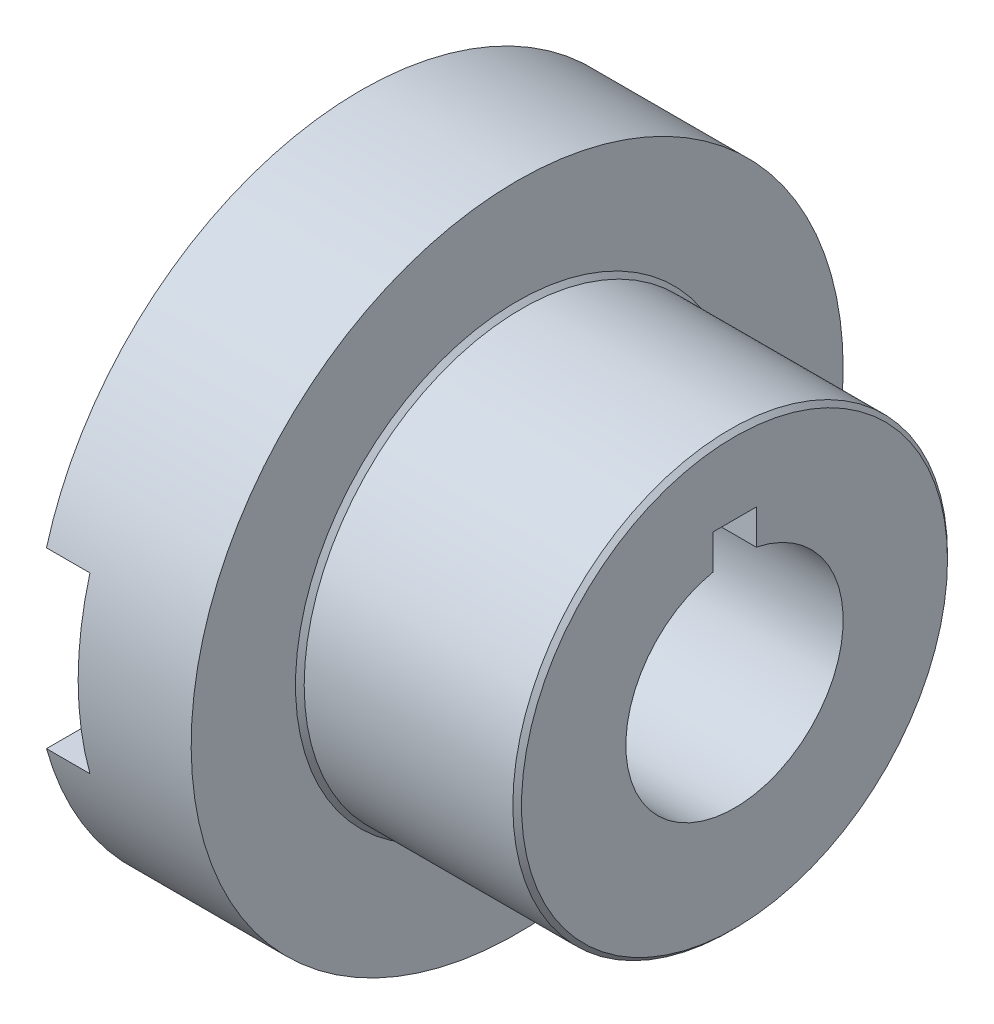
ISO-10303-21;
HEADER;
FILE_DESCRIPTION(('STEP AP214'),'2;1');
FILE_NAME('part.step','',(''),(''),'','','');
FILE_SCHEMA(('AUTOMOTIVE_DESIGN { 1 0 10303 214 1 1 1 1 }'));
ENDSEC;
DATA;
#1=APPLICATION_CONTEXT('core data for automotive mechanical design processes');
#2=APPLICATION_PROTOCOL_DEFINITION('international standard','automotive_design',2000,#1);
#3=PRODUCT_CONTEXT('',#1,'mechanical');
#4=PRODUCT('Part','Part','',(#3));
#5=PRODUCT_RELATED_PRODUCT_CATEGORY('part','',(#4));
#6=PRODUCT_DEFINITION_FORMATION('','',#4);
#7=PRODUCT_DEFINITION_CONTEXT('part definition',#1,'design');
#8=PRODUCT_DEFINITION('design','',#6,#7);
#9=PRODUCT_DEFINITION_SHAPE('','',#8);
#10=(LENGTH_UNIT() NAMED_UNIT(*) SI_UNIT(.MILLI.,.METRE.));
#11=(NAMED_UNIT(*) PLANE_ANGLE_UNIT() SI_UNIT($,.RADIAN.));
#12=(NAMED_UNIT(*) SI_UNIT($,.STERADIAN.) SOLID_ANGLE_UNIT());
#13=UNCERTAINTY_MEASURE_WITH_UNIT(LENGTH_MEASURE(1.E-05),#10,'distance_accuracy_value','');
#14=(GEOMETRIC_REPRESENTATION_CONTEXT(3) GLOBAL_UNCERTAINTY_ASSIGNED_CONTEXT((#13)) GLOBAL_UNIT_ASSIGNED_CONTEXT((#10,
#11,#12)) REPRESENTATION_CONTEXT('',''));
#15=CARTESIAN_POINT('',(0.,0.,0.));
#16=DIRECTION('',(0.,0.,1.));
#17=DIRECTION('',(1.,0.,0.));
#18=AXIS2_PLACEMENT_3D('',#15,#16,#17);
#19=CARTESIAN_POINT('',(10.,0.,0.));
#20=DIRECTION('',(-1.,0.,0.));
#21=DIRECTION('',(0.,0.,1.));
#22=AXIS2_PLACEMENT_3D('',#19,#20,#21);
#23=PLANE('',#22);
#24=CARTESIAN_POINT('',(9.99999999999999,0.,0.));
#25=DIRECTION('',(-1.,0.,0.));
#26=DIRECTION('',(0.,0.,1.));
#27=AXIS2_PLACEMENT_3D('',#24,#25,#26);
#28=CIRCLE('',#27,25.);
#29=CARTESIAN_POINT('',(9.99999999999999,20.,-15.));
#30=VERTEX_POINT('',#29);
#31=CARTESIAN_POINT('',(9.99999999999999,-20.,-15.));
#32=VERTEX_POINT('',#31);
#33=EDGE_CURVE('E213',#30,#32,#28,.T.);
#34=ORIENTED_EDGE('',*,*,#33,.F.);
#35=DIRECTION('',(0.,0.,-1.));
#36=VECTOR('',#35,1.);
#37=CARTESIAN_POINT('',(10.,20.,-72.2841614740048));
#38=LINE('',#37,#36);
#39=CARTESIAN_POINT('',(10.,20.,-72.2841614740048));
#40=VERTEX_POINT('',#39);
#41=EDGE_CURVE('E178',#30,#40,#38,.T.);
#42=ORIENTED_EDGE('',*,*,#41,.T.);
#43=CARTESIAN_POINT('',(10.,0.,0.));
#44=DIRECTION('',(-1.,0.,0.));
#45=DIRECTION('',(0.,0.,1.));
#46=AXIS2_PLACEMENT_3D('',#43,#44,#45);
#47=CIRCLE('',#46,75.);
#48=CARTESIAN_POINT('',(10.,-20.,-72.2841614740048));
#49=VERTEX_POINT('',#48);
#50=EDGE_CURVE('E164',#40,#49,#47,.T.);
#51=ORIENTED_EDGE('',*,*,#50,.T.);
#52=DIRECTION('',(0.,0.,1.));
#53=VECTOR('',#52,1.);
#54=CARTESIAN_POINT('',(10.,-20.,-72.2841614740048));
#55=LINE('',#54,#53);
#56=EDGE_CURVE('E170',#49,#32,#55,.T.);
#57=ORIENTED_EDGE('',*,*,#56,.T.);
#58=EDGE_LOOP('',(#34,#42,#51,#57));
#59=FACE_BOUND('',#58,.T.);
#60=ADVANCED_FACE('F47',(#59),#23,.T.);
#61=CARTESIAN_POINT('',(0.,0.,0.));
#62=DIRECTION('',(1.,0.,0.));
#63=DIRECTION('',(0.,0.,-1.));
#64=AXIS2_PLACEMENT_3D('',#61,#62,#63);
#65=PLANE('',#64);
#66=CARTESIAN_POINT('',(0.,0.,0.));
#67=DIRECTION('',(1.,0.,0.));
#68=DIRECTION('',(0.,0.,-1.));
#69=AXIS2_PLACEMENT_3D('',#66,#67,#68);
#70=CIRCLE('',#69,75.);
#71=CARTESIAN_POINT('',(0.,20.,-72.2841614740048));
#72=VERTEX_POINT('',#71);
#73=CARTESIAN_POINT('',(0.,20.,72.2841614740048));
#74=VERTEX_POINT('',#73);
#75=EDGE_CURVE('E207',#72,#74,#70,.T.);
#76=ORIENTED_EDGE('',*,*,#75,.F.);
#77=DIRECTION('',(0.,0.,-1.));
#78=VECTOR('',#77,1.);
#79=CARTESIAN_POINT('',(0.,20.,-72.2841614740048));
#80=LINE('',#79,#78);
#81=EDGE_CURVE('E169',#74,#72,#80,.T.);
#82=ORIENTED_EDGE('',*,*,#81,.F.);
#83=EDGE_LOOP('',(#76,#82));
#84=FACE_BOUND('',#83,.T.);
#85=ADVANCED_FACE('F239',(#84),#65,.F.);
#86=CARTESIAN_POINT('',(36.,0.,0.));
#87=DIRECTION('',(-1.,0.,0.));
#88=DIRECTION('',(0.,0.,1.));
#89=AXIS2_PLACEMENT_3D('',#86,#87,#88);
#90=CYLINDRICAL_SURFACE('',#89,75.);
#91=ORIENTED_EDGE('',*,*,#50,.F.);
#92=DIRECTION('',(-1.,0.,0.));
#93=VECTOR('',#92,1.);
#94=CARTESIAN_POINT('',(10.,20.,-72.2841614740048));
#95=LINE('',#94,#93);
#96=EDGE_CURVE('E188',#40,#72,#95,.T.);
#97=ORIENTED_EDGE('',*,*,#96,.T.);
#98=ORIENTED_EDGE('',*,*,#75,.T.);
#99=DIRECTION('',(-1.,0.,0.));
#100=VECTOR('',#99,1.);
#101=CARTESIAN_POINT('',(10.,20.,72.2841614740048));
#102=LINE('',#101,#100);
#103=CARTESIAN_POINT('',(10.,20.,72.2841614740048));
#104=VERTEX_POINT('',#103);
#105=EDGE_CURVE('E193',#104,#74,#102,.T.);
#106=ORIENTED_EDGE('',*,*,#105,.F.);
#107=CARTESIAN_POINT('',(10.,0.,0.));
#108=DIRECTION('',(-1.,0.,0.));
#109=DIRECTION('',(0.,0.,1.));
#110=AXIS2_PLACEMENT_3D('',#107,#108,#109);
#111=CIRCLE('',#110,75.);
#112=CARTESIAN_POINT('',(10.,-20.,72.2841614740048));
#113=VERTEX_POINT('',#112);
#114=EDGE_CURVE('E174',#113,#104,#111,.T.);
#115=ORIENTED_EDGE('',*,*,#114,.F.);
#116=DIRECTION('',(-1.,0.,0.));
#117=VECTOR('',#116,1.);
#118=CARTESIAN_POINT('',(10.,-20.,72.2841614740048));
#119=LINE('',#118,#117);
#120=CARTESIAN_POINT('',(0.,-20.,72.2841614740048));
#121=VERTEX_POINT('',#120);
#122=EDGE_CURVE('E196',#113,#121,#119,.T.);
#123=ORIENTED_EDGE('',*,*,#122,.T.);
#124=CARTESIAN_POINT('',(0.,-20.,-72.2841614740048));
#125=VERTEX_POINT('',#124);
#126=EDGE_CURVE('E192',#121,#125,#70,.T.);
#127=ORIENTED_EDGE('',*,*,#126,.T.);
#128=DIRECTION('',(-1.,0.,0.));
#129=VECTOR('',#128,1.);
#130=CARTESIAN_POINT('',(10.,-20.,-72.2841614740048));
#131=LINE('',#130,#129);
#132=EDGE_CURVE('E183',#49,#125,#131,.T.);
#133=ORIENTED_EDGE('',*,*,#132,.F.);
#134=EDGE_LOOP('',(#91,#97,#98,#106,#115,#123,#127,#133));
#135=FACE_BOUND('',#134,.T.);
#136=CARTESIAN_POINT('',(36.,0.,0.));
#137=DIRECTION('',(1.,0.,0.));
#138=DIRECTION('',(0.,0.,-1.));
#139=AXIS2_PLACEMENT_3D('',#136,#137,#138);
#140=CIRCLE('',#139,75.);
#141=CARTESIAN_POINT('',(36.,0.,-75.));
#142=VERTEX_POINT('',#141);
#143=EDGE_CURVE('E202',#142,#142,#140,.T.);
#144=ORIENTED_EDGE('',*,*,#143,.F.);
#145=EDGE_LOOP('',(#144));
#146=FACE_BOUND('',#145,.T.);
#147=ADVANCED_FACE('F248',(#135,#146),#90,.T.);
#148=CARTESIAN_POINT('',(36.,0.,0.));
#149=DIRECTION('',(1.,0.,0.));
#150=DIRECTION('',(0.,0.,-1.));
#151=AXIS2_PLACEMENT_3D('',#148,#149,#150);
#152=PLANE('',#151);
#153=CARTESIAN_POINT('',(36.,0.,0.));
#154=DIRECTION('',(1.,0.,0.));
#155=DIRECTION('',(0.,0.,-1.));
#156=AXIS2_PLACEMENT_3D('',#153,#154,#155);
#157=CIRCLE('',#156,51.);
#158=CARTESIAN_POINT('',(36.,0.,-51.));
#159=VERTEX_POINT('',#158);
#160=EDGE_CURVE('E11',#159,#159,#157,.F.);
#161=ORIENTED_EDGE('',*,*,#160,.T.);
#162=EDGE_LOOP('',(#161));
#163=FACE_BOUND('',#162,.T.);
#164=ORIENTED_EDGE('',*,*,#143,.T.);
#165=EDGE_LOOP('',(#164));
#166=FACE_BOUND('',#165,.T.);
#167=ADVANCED_FACE('F308',(#163,#166),#152,.T.);
#168=ORIENTED_EDGE('',*,*,#126,.F.);
#169=DIRECTION('',(0.,0.,1.));
#170=VECTOR('',#169,1.);
#171=CARTESIAN_POINT('',(0.,-20.,-72.2841614740048));
#172=LINE('',#171,#170);
#173=EDGE_CURVE('E162',#125,#121,#172,.T.);
#174=ORIENTED_EDGE('',*,*,#173,.F.);
#175=EDGE_LOOP('',(#168,#174));
#176=FACE_BOUND('',#175,.T.);
#177=ADVANCED_FACE('F251',(#176),#65,.F.);
#178=CARTESIAN_POINT('',(86.,0.,0.));
#179=DIRECTION('',(-1.,0.,0.));
#180=DIRECTION('',(0.,0.,1.));
#181=AXIS2_PLACEMENT_3D('',#178,#179,#180);
#182=CYLINDRICAL_SURFACE('',#181,50.);
#183=CARTESIAN_POINT('',(37.,0.,0.));
#184=DIRECTION('',(1.,0.,0.));
#185=DIRECTION('',(0.,0.,-1.));
#186=AXIS2_PLACEMENT_3D('',#183,#184,#185);
#187=CIRCLE('',#186,50.);
#188=CARTESIAN_POINT('',(37.,0.,-50.));
#189=VERTEX_POINT('',#188);
#190=EDGE_CURVE('E57',#189,#189,#187,.T.);
#191=ORIENTED_EDGE('',*,*,#190,.T.);
#192=EDGE_LOOP('',(#191));
#193=FACE_BOUND('',#192,.T.);
#194=CARTESIAN_POINT('',(85.,0.,0.));
#195=DIRECTION('',(1.,0.,0.));
#196=DIRECTION('',(0.,0.,-1.));
#197=AXIS2_PLACEMENT_3D('',#194,#195,#196);
#198=CIRCLE('',#197,50.);
#199=CARTESIAN_POINT('',(85.,0.,-50.));
#200=VERTEX_POINT('',#199);
#201=EDGE_CURVE('E218',#200,#200,#198,.F.);
#202=ORIENTED_EDGE('',*,*,#201,.T.);
#203=EDGE_LOOP('',(#202));
#204=FACE_BOUND('',#203,.T.);
#205=ADVANCED_FACE('F225',(#193,#204),#182,.T.);
#206=CARTESIAN_POINT('',(86.,0.,0.));
#207=DIRECTION('',(1.,0.,0.));
#208=DIRECTION('',(0.,0.,-1.));
#209=AXIS2_PLACEMENT_3D('',#206,#207,#208);
#210=PLANE('',#209);
#211=CARTESIAN_POINT('',(86.,0.,0.));
#212=DIRECTION('',(1.,0.,0.));
#213=DIRECTION('',(0.,0.,-1.));
#214=AXIS2_PLACEMENT_3D('',#211,#212,#213);
#215=CIRCLE('',#214,49.);
#216=CARTESIAN_POINT('',(86.,0.,-49.));
#217=VERTEX_POINT('',#216);
#218=EDGE_CURVE('E214',#217,#217,#215,.T.);
#219=ORIENTED_EDGE('',*,*,#218,.T.);
#220=EDGE_LOOP('',(#219));
#221=FACE_BOUND('',#220,.T.);
#222=CARTESIAN_POINT('',(86.,0.,0.));
#223=DIRECTION('',(1.,0.,0.));
#224=DIRECTION('',(0.,0.,-1.));
#225=AXIS2_PLACEMENT_3D('',#222,#223,#224);
#226=CIRCLE('',#225,25.);
#227=CARTESIAN_POINT('',(86.,24.4948974278318,5.));
#228=VERTEX_POINT('',#227);
#229=CARTESIAN_POINT('',(86.,24.4948974278318,-5.));
#230=VERTEX_POINT('',#229);
#231=EDGE_CURVE('E151',#228,#230,#226,.T.);
#232=ORIENTED_EDGE('',*,*,#231,.F.);
#233=DIRECTION('',(0.,-1.,0.));
#234=VECTOR('',#233,1.);
#235=CARTESIAN_POINT('',(86.,32.4948974278318,5.));
#236=LINE('',#235,#234);
#237=CARTESIAN_POINT('',(86.,32.4948974278318,5.));
#238=VERTEX_POINT('',#237);
#239=EDGE_CURVE('E277',#238,#228,#236,.T.);
#240=ORIENTED_EDGE('',*,*,#239,.F.);
#241=DIRECTION('',(0.,0.,1.));
#242=VECTOR('',#241,1.);
#243=CARTESIAN_POINT('',(86.,32.4948974278318,5.));
#244=LINE('',#243,#242);
#245=CARTESIAN_POINT('',(86.,32.4948974278318,-5.));
#246=VERTEX_POINT('',#245);
#247=EDGE_CURVE('E64',#246,#238,#244,.T.);
#248=ORIENTED_EDGE('',*,*,#247,.F.);
#249=DIRECTION('',(0.,1.,0.));
#250=VECTOR('',#249,1.);
#251=CARTESIAN_POINT('',(86.,32.4948974278318,-5.));
#252=LINE('',#251,#250);
#253=EDGE_CURVE('E294',#230,#246,#252,.T.);
#254=ORIENTED_EDGE('',*,*,#253,.F.);
#255=EDGE_LOOP('',(#232,#240,#248,#254));
#256=FACE_BOUND('',#255,.T.);
#257=ADVANCED_FACE('F291',(#221,#256),#210,.T.);
#258=CARTESIAN_POINT('',(10.,20.,-72.2841614740048));
#259=DIRECTION('',(0.,1.,0.));
#260=DIRECTION('',(0.,0.,1.));
#261=AXIS2_PLACEMENT_3D('',#258,#259,#260);
#262=PLANE('',#261);
#263=ORIENTED_EDGE('',*,*,#81,.T.);
#264=ORIENTED_EDGE('',*,*,#96,.F.);
#265=ORIENTED_EDGE('',*,*,#41,.F.);
#266=CARTESIAN_POINT('',(9.99999999999999,20.,15.));
#267=VERTEX_POINT('',#266);
#268=EDGE_CURVE('E134',#267,#30,#38,.T.);
#269=ORIENTED_EDGE('',*,*,#268,.F.);
#270=EDGE_CURVE('E179',#104,#267,#38,.T.);
#271=ORIENTED_EDGE('',*,*,#270,.F.);
#272=ORIENTED_EDGE('',*,*,#105,.T.);
#273=EDGE_LOOP('',(#263,#264,#265,#269,#271,#272));
#274=FACE_BOUND('',#273,.T.);
#275=ADVANCED_FACE('F262',(#274),#262,.F.);
#276=CARTESIAN_POINT('',(10.,-20.,-72.2841614740048));
#277=DIRECTION('',(0.,-1.,0.));
#278=DIRECTION('',(0.,0.,-1.));
#279=AXIS2_PLACEMENT_3D('',#276,#277,#278);
#280=PLANE('',#279);
#281=ORIENTED_EDGE('',*,*,#173,.T.);
#282=ORIENTED_EDGE('',*,*,#122,.F.);
#283=CARTESIAN_POINT('',(9.99999999999999,-20.,15.));
#284=VERTEX_POINT('',#283);
#285=EDGE_CURVE('E168',#284,#113,#55,.T.);
#286=ORIENTED_EDGE('',*,*,#285,.F.);
#287=EDGE_CURVE('E175',#32,#284,#55,.T.);
#288=ORIENTED_EDGE('',*,*,#287,.F.);
#289=ORIENTED_EDGE('',*,*,#56,.F.);
#290=ORIENTED_EDGE('',*,*,#132,.T.);
#291=EDGE_LOOP('',(#281,#282,#286,#288,#289,#290));
#292=FACE_BOUND('',#291,.T.);
#293=ADVANCED_FACE('F255',(#292),#280,.F.);
#294=EDGE_CURVE('E206',#284,#267,#28,.T.);
#295=ORIENTED_EDGE('',*,*,#294,.F.);
#296=ORIENTED_EDGE('',*,*,#285,.T.);
#297=ORIENTED_EDGE('',*,*,#114,.T.);
#298=ORIENTED_EDGE('',*,*,#270,.T.);
#299=EDGE_LOOP('',(#295,#296,#297,#298));
#300=FACE_BOUND('',#299,.T.);
#301=ADVANCED_FACE('F242',(#300),#23,.T.);
#302=CARTESIAN_POINT('',(10.,0.,0.));
#303=DIRECTION('',(-1.,0.,0.));
#304=DIRECTION('',(0.,0.,1.));
#305=AXIS2_PLACEMENT_3D('',#302,#303,#304);
#306=PLANE('',#305);
#307=CARTESIAN_POINT('',(9.99999999999999,0.,0.));
#308=DIRECTION('',(-1.,0.,0.));
#309=DIRECTION('',(0.,0.,1.));
#310=AXIS2_PLACEMENT_3D('',#307,#308,#309);
#311=CIRCLE('',#310,25.);
#312=CARTESIAN_POINT('',(9.99999999999999,24.4948974278318,-5.));
#313=VERTEX_POINT('',#312);
#314=EDGE_CURVE('E127',#30,#313,#311,.F.);
#315=ORIENTED_EDGE('',*,*,#314,.T.);
#316=DIRECTION('',(0.,1.,0.));
#317=VECTOR('',#316,1.);
#318=CARTESIAN_POINT('',(9.99999999999999,32.4948974278318,-5.));
#319=LINE('',#318,#317);
#320=CARTESIAN_POINT('',(9.99999999999999,32.4948974278318,-5.));
#321=VERTEX_POINT('',#320);
#322=EDGE_CURVE('E131',#313,#321,#319,.T.);
#323=ORIENTED_EDGE('',*,*,#322,.T.);
#324=DIRECTION('',(0.,0.,1.));
#325=VECTOR('',#324,1.);
#326=CARTESIAN_POINT('',(9.99999999999999,32.4948974278318,5.));
#327=LINE('',#326,#325);
#328=CARTESIAN_POINT('',(9.99999999999999,32.4948974278318,5.));
#329=VERTEX_POINT('',#328);
#330=EDGE_CURVE('E283',#321,#329,#327,.T.);
#331=ORIENTED_EDGE('',*,*,#330,.T.);
#332=DIRECTION('',(0.,-1.,0.));
#333=VECTOR('',#332,1.);
#334=CARTESIAN_POINT('',(9.99999999999999,32.4948974278318,5.));
#335=LINE('',#334,#333);
#336=CARTESIAN_POINT('',(9.99999999999999,24.4948974278318,5.));
#337=VERTEX_POINT('',#336);
#338=EDGE_CURVE('E163',#329,#337,#335,.T.);
#339=ORIENTED_EDGE('',*,*,#338,.T.);
#340=EDGE_CURVE('E139',#337,#267,#311,.F.);
#341=ORIENTED_EDGE('',*,*,#340,.T.);
#342=ORIENTED_EDGE('',*,*,#268,.T.);
#343=EDGE_LOOP('',(#315,#323,#331,#339,#341,#342));
#344=FACE_BOUND('',#343,.T.);
#345=ADVANCED_FACE('F129',(#344),#306,.F.);
#346=EDGE_CURVE('E72',#284,#32,#311,.F.);
#347=ORIENTED_EDGE('',*,*,#346,.T.);
#348=ORIENTED_EDGE('',*,*,#287,.T.);
#349=EDGE_LOOP('',(#347,#348));
#350=FACE_BOUND('',#349,.T.);
#351=ADVANCED_FACE('F261',(#350),#306,.F.);
#352=CARTESIAN_POINT('',(-66.1949029150697,0.,0.));
#353=DIRECTION('',(1.,0.,0.));
#354=DIRECTION('',(0.,0.,-1.));
#355=AXIS2_PLACEMENT_3D('',#352,#353,#354);
#356=CYLINDRICAL_SURFACE('',#355,25.);
#357=DIRECTION('',(1.,0.,0.));
#358=VECTOR('',#357,1.);
#359=CARTESIAN_POINT('',(-66.1949029150697,24.4948974278318,5.));
#360=LINE('',#359,#358);
#361=EDGE_CURVE('E159',#337,#228,#360,.T.);
#362=ORIENTED_EDGE('',*,*,#361,.T.);
#363=ORIENTED_EDGE('',*,*,#231,.T.);
#364=DIRECTION('',(1.,0.,0.));
#365=VECTOR('',#364,1.);
#366=CARTESIAN_POINT('',(-66.1949029150697,24.4948974278318,-5.));
#367=LINE('',#366,#365);
#368=EDGE_CURVE('E144',#313,#230,#367,.T.);
#369=ORIENTED_EDGE('',*,*,#368,.F.);
#370=ORIENTED_EDGE('',*,*,#314,.F.);
#371=ORIENTED_EDGE('',*,*,#33,.T.);
#372=ORIENTED_EDGE('',*,*,#346,.F.);
#373=ORIENTED_EDGE('',*,*,#294,.T.);
#374=ORIENTED_EDGE('',*,*,#340,.F.);
#375=EDGE_LOOP('',(#362,#363,#369,#370,#371,#372,#373,#374));
#376=FACE_BOUND('',#375,.T.);
#377=ADVANCED_FACE('F149',(#376),#356,.F.);
#378=CARTESIAN_POINT('',(-66.1949029150697,32.4948974278318,-5.));
#379=DIRECTION('',(0.,0.,-1.));
#380=DIRECTION('',(0.,1.,0.));
#381=AXIS2_PLACEMENT_3D('',#378,#379,#380);
#382=PLANE('',#381);
#383=ORIENTED_EDGE('',*,*,#368,.T.);
#384=ORIENTED_EDGE('',*,*,#253,.T.);
#385=DIRECTION('',(1.,0.,0.));
#386=VECTOR('',#385,1.);
#387=CARTESIAN_POINT('',(-66.1949029150697,32.4948974278318,-5.));
#388=LINE('',#387,#386);
#389=EDGE_CURVE('E146',#321,#246,#388,.T.);
#390=ORIENTED_EDGE('',*,*,#389,.F.);
#391=ORIENTED_EDGE('',*,*,#322,.F.);
#392=EDGE_LOOP('',(#383,#384,#390,#391));
#393=FACE_BOUND('',#392,.T.);
#394=ADVANCED_FACE('F142',(#393),#382,.F.);
#395=CARTESIAN_POINT('',(-66.1949029150697,32.4948974278318,5.));
#396=DIRECTION('',(0.,1.,0.));
#397=DIRECTION('',(0.,0.,1.));
#398=AXIS2_PLACEMENT_3D('',#395,#396,#397);
#399=PLANE('',#398);
#400=ORIENTED_EDGE('',*,*,#389,.T.);
#401=ORIENTED_EDGE('',*,*,#247,.T.);
#402=DIRECTION('',(1.,0.,0.));
#403=VECTOR('',#402,1.);
#404=CARTESIAN_POINT('',(-66.1949029150697,32.4948974278318,5.));
#405=LINE('',#404,#403);
#406=EDGE_CURVE('E282',#329,#238,#405,.T.);
#407=ORIENTED_EDGE('',*,*,#406,.F.);
#408=ORIENTED_EDGE('',*,*,#330,.F.);
#409=EDGE_LOOP('',(#400,#401,#407,#408));
#410=FACE_BOUND('',#409,.T.);
#411=ADVANCED_FACE('F415',(#410),#399,.F.);
#412=CARTESIAN_POINT('',(-66.1949029150697,32.4948974278318,5.));
#413=DIRECTION('',(0.,0.,1.));
#414=DIRECTION('',(0.,-1.,0.));
#415=AXIS2_PLACEMENT_3D('',#412,#413,#414);
#416=PLANE('',#415);
#417=ORIENTED_EDGE('',*,*,#406,.T.);
#418=ORIENTED_EDGE('',*,*,#239,.T.);
#419=ORIENTED_EDGE('',*,*,#361,.F.);
#420=ORIENTED_EDGE('',*,*,#338,.F.);
#421=EDGE_LOOP('',(#417,#418,#419,#420));
#422=FACE_BOUND('',#421,.T.);
#423=ADVANCED_FACE('F235',(#422),#416,.F.);
#424=CARTESIAN_POINT('',(86.,0.,0.));
#425=DIRECTION('',(-1.,0.,0.));
#426=DIRECTION('',(0.,0.,1.));
#427=AXIS2_PLACEMENT_3D('',#424,#425,#426);
#428=CONICAL_SURFACE('',#427,49.,0.785398163397438);
#429=ORIENTED_EDGE('',*,*,#201,.F.);
#430=EDGE_LOOP('',(#429));
#431=FACE_BOUND('',#430,.T.);
#432=ORIENTED_EDGE('',*,*,#218,.F.);
#433=EDGE_LOOP('',(#432));
#434=FACE_BOUND('',#433,.T.);
#435=ADVANCED_FACE('F229',(#431,#434),#428,.T.);
#436=CARTESIAN_POINT('',(37.,0.,0.));
#437=DIRECTION('',(-1.,0.,0.));
#438=DIRECTION('',(0.,0.,1.));
#439=AXIS2_PLACEMENT_3D('',#436,#437,#438);
#440=CONICAL_SURFACE('',#439,50.,0.785398163397448);
#441=ORIENTED_EDGE('',*,*,#160,.F.);
#442=EDGE_LOOP('',(#441));
#443=FACE_BOUND('',#442,.T.);
#444=ORIENTED_EDGE('',*,*,#190,.F.);
#445=EDGE_LOOP('',(#444));
#446=FACE_BOUND('',#445,.T.);
#447=ADVANCED_FACE('F50',(#443,#446),#440,.T.);
#448=CLOSED_SHELL('',(#60,#85,#147,#167,#177,#205,#257,#275,#293,#301,#345,#351,#377,#394,#411,
#423,#435,#447));
#449=MANIFOLD_SOLID_BREP('B2',#448);
#450=ADVANCED_BREP_SHAPE_REPRESENTATION('',(#18,#449),#14);
#451=SHAPE_DEFINITION_REPRESENTATION(#9,#450);
ENDSEC;
END-ISO-10303-21;
